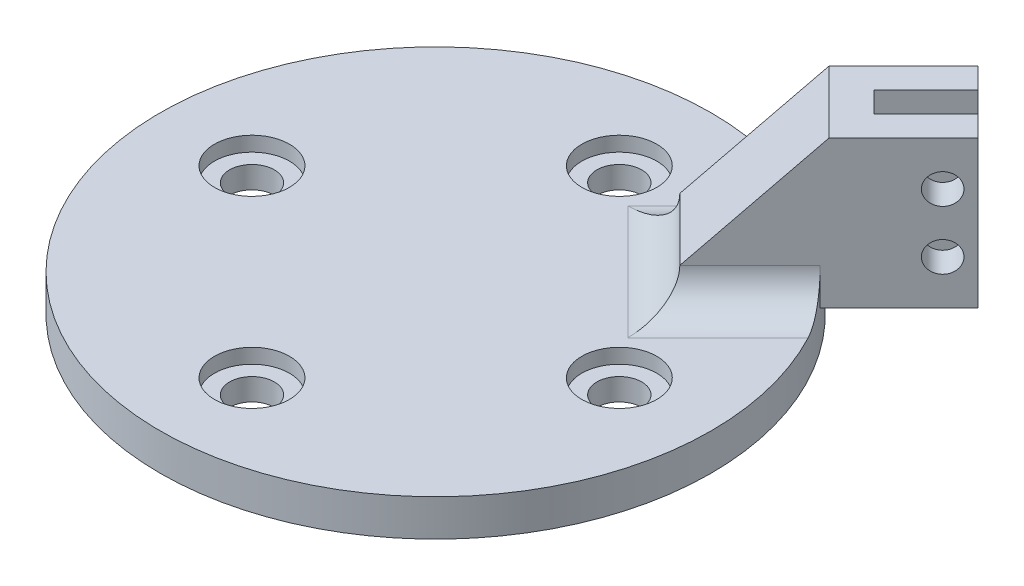
ISO-10303-21;
HEADER;
FILE_DESCRIPTION(('STEP AP214'),'2;1');
FILE_NAME('part.step','',(''),(''),'','','');
FILE_SCHEMA(('AUTOMOTIVE_DESIGN { 1 0 10303 214 1 1 1 1 }'));
ENDSEC;
DATA;
#1=APPLICATION_CONTEXT('core data for automotive mechanical design processes');
#2=APPLICATION_PROTOCOL_DEFINITION('international standard','automotive_design',2000,#1);
#3=PRODUCT_CONTEXT('',#1,'mechanical');
#4=PRODUCT('Part','Part','',(#3));
#5=PRODUCT_RELATED_PRODUCT_CATEGORY('part','',(#4));
#6=PRODUCT_DEFINITION_FORMATION('','',#4);
#7=PRODUCT_DEFINITION_CONTEXT('part definition',#1,'design');
#8=PRODUCT_DEFINITION('design','',#6,#7);
#9=PRODUCT_DEFINITION_SHAPE('','',#8);
#10=(LENGTH_UNIT() NAMED_UNIT(*) SI_UNIT(.MILLI.,.METRE.));
#11=(NAMED_UNIT(*) PLANE_ANGLE_UNIT() SI_UNIT($,.RADIAN.));
#12=(NAMED_UNIT(*) SI_UNIT($,.STERADIAN.) SOLID_ANGLE_UNIT());
#13=UNCERTAINTY_MEASURE_WITH_UNIT(LENGTH_MEASURE(1.E-05),#10,'distance_accuracy_value','');
#14=(GEOMETRIC_REPRESENTATION_CONTEXT(3) GLOBAL_UNCERTAINTY_ASSIGNED_CONTEXT((#13)) GLOBAL_UNIT_ASSIGNED_CONTEXT((#10,
#11,#12)) REPRESENTATION_CONTEXT('',''));
#15=CARTESIAN_POINT('',(0.,0.,0.));
#16=DIRECTION('',(0.,0.,1.));
#17=DIRECTION('',(1.,0.,0.));
#18=AXIS2_PLACEMENT_3D('',#15,#16,#17);
#19=CARTESIAN_POINT('',(29.8399061660723,25.,-29.8399061660724));
#20=DIRECTION('',(0.707106781186546,0.,-0.707106781186549));
#21=DIRECTION('',(-0.707106781186549,0.,-0.707106781186546));
#22=AXIS2_PLACEMENT_3D('',#19,#20,#21);
#23=PLANE('',#22);
#24=DIRECTION('',(0.707106781186549,0.,0.707106781186546));
#25=VECTOR('',#24,1.);
#26=CARTESIAN_POINT('',(29.8399061660723,5.,-29.8399061660724));
#27=LINE('',#26,#25);
#28=CARTESIAN_POINT('',(28.4256926036992,5.,-31.2541197284455));
#29=VERTEX_POINT('',#28);
#30=CARTESIAN_POINT('',(31.2541197284453,5.,-28.4256926036993));
#31=VERTEX_POINT('',#30);
#32=EDGE_CURVE('E381',#29,#31,#27,.T.);
#33=ORIENTED_EDGE('',*,*,#32,.F.);
#34=DIRECTION('',(0.,-1.,0.));
#35=VECTOR('',#34,1.);
#36=CARTESIAN_POINT('',(28.4256926036992,25.,-31.2541197284455));
#37=LINE('',#36,#35);
#38=CARTESIAN_POINT('',(28.4256926036992,25.,-31.2541197284455));
#39=VERTEX_POINT('',#38);
#40=EDGE_CURVE('E348',#39,#29,#37,.T.);
#41=ORIENTED_EDGE('',*,*,#40,.F.);
#42=DIRECTION('',(0.707106781186549,0.,0.707106781186546));
#43=VECTOR('',#42,1.);
#44=CARTESIAN_POINT('',(29.8399061660723,25.,-29.8399061660724));
#45=LINE('',#44,#43);
#46=CARTESIAN_POINT('',(31.2541197284453,25.,-28.4256926036993));
#47=VERTEX_POINT('',#46);
#48=EDGE_CURVE('E383',#39,#47,#45,.T.);
#49=ORIENTED_EDGE('',*,*,#48,.T.);
#50=DIRECTION('',(0.,1.,0.));
#51=VECTOR('',#50,1.);
#52=CARTESIAN_POINT('',(31.2541197284453,25.,-28.4256926036993));
#53=LINE('',#52,#51);
#54=EDGE_CURVE('E351',#31,#47,#53,.T.);
#55=ORIENTED_EDGE('',*,*,#54,.F.);
#56=EDGE_LOOP('',(#33,#41,#49,#55));
#57=FACE_BOUND('',#56,.T.);
#58=ADVANCED_FACE('F41',(#57),#23,.T.);
#59=CARTESIAN_POINT('',(0.,5.,0.));
#60=DIRECTION('',(0.,1.,0.));
#61=DIRECTION('',(0.,0.,1.));
#62=AXIS2_PLACEMENT_3D('',#59,#60,#61);
#63=PLANE('',#62);
#64=CARTESIAN_POINT('',(-25.,5.,0.));
#65=DIRECTION('',(0.,1.,0.));
#66=DIRECTION('',(1.,0.,0.));
#67=AXIS2_PLACEMENT_3D('',#64,#65,#66);
#68=CIRCLE('',#67,5.1);
#69=CARTESIAN_POINT('',(-19.9,5.,0.));
#70=VERTEX_POINT('',#69);
#71=EDGE_CURVE('E277',#70,#70,#68,.T.);
#72=ORIENTED_EDGE('',*,*,#71,.F.);
#73=EDGE_LOOP('',(#72));
#74=FACE_BOUND('',#73,.T.);
#75=CARTESIAN_POINT('',(0.,5.,25.));
#76=DIRECTION('',(0.,1.,0.));
#77=DIRECTION('',(0.,0.,-1.));
#78=AXIS2_PLACEMENT_3D('',#75,#76,#77);
#79=CIRCLE('',#78,5.1);
#80=CARTESIAN_POINT('',(0.,5.,19.9));
#81=VERTEX_POINT('',#80);
#82=EDGE_CURVE('E399',#81,#81,#79,.T.);
#83=ORIENTED_EDGE('',*,*,#82,.F.);
#84=EDGE_LOOP('',(#83));
#85=FACE_BOUND('',#84,.T.);
#86=CARTESIAN_POINT('',(25.,5.,-2.60126376937258E-13));
#87=DIRECTION('',(0.,1.,0.));
#88=DIRECTION('',(-1.,0.,0.));
#89=AXIS2_PLACEMENT_3D('',#86,#87,#88);
#90=CIRCLE('',#89,5.1);
#91=CARTESIAN_POINT('',(19.9,5.,-2.06706712452958E-13));
#92=VERTEX_POINT('',#91);
#93=EDGE_CURVE('E281',#92,#92,#90,.T.);
#94=ORIENTED_EDGE('',*,*,#93,.F.);
#95=EDGE_LOOP('',(#94));
#96=FACE_BOUND('',#95,.T.);
#97=CARTESIAN_POINT('',(0.,5.,-25.));
#98=DIRECTION('',(0.,1.,0.));
#99=DIRECTION('',(0.,0.,1.));
#100=AXIS2_PLACEMENT_3D('',#97,#98,#99);
#101=CIRCLE('',#100,5.1);
#102=CARTESIAN_POINT('',(0.,5.,-19.9));
#103=VERTEX_POINT('',#102);
#104=EDGE_CURVE('E270',#103,#103,#101,.T.);
#105=ORIENTED_EDGE('',*,*,#104,.F.);
#106=EDGE_LOOP('',(#105));
#107=FACE_BOUND('',#106,.T.);
#108=DIRECTION('',(0.707106781186549,0.,0.707106781186546));
#109=VECTOR('',#108,1.);
#110=CARTESIAN_POINT('',(13.0814754519511,5.,-13.0814754519512));
#111=LINE('',#110,#109);
#112=CARTESIAN_POINT('',(20.8596500450031,5.,-5.30330085889915));
#113=VERTEX_POINT('',#112);
#114=CARTESIAN_POINT('',(5.30330085889908,5.,-20.8596500450032));
#115=VERTEX_POINT('',#114);
#116=EDGE_CURVE('E158',#113,#115,#111,.F.);
#117=ORIENTED_EDGE('',*,*,#116,.T.);
#118=DIRECTION('',(0.707106781186546,0.,-0.707106781186549));
#119=VECTOR('',#118,1.);
#120=CARTESIAN_POINT('',(18.3967179568706,5.,-33.9530671429748));
#121=LINE('',#120,#119);
#122=CARTESIAN_POINT('',(17.5718747165647,5.,-33.1282239026688));
#123=VERTEX_POINT('',#122);
#124=EDGE_CURVE('E313',#115,#123,#121,.T.);
#125=ORIENTED_EDGE('',*,*,#124,.T.);
#126=CARTESIAN_POINT('',(0.,5.,0.));
#127=DIRECTION('',(0.,1.,0.));
#128=DIRECTION('',(0.,0.,1.));
#129=AXIS2_PLACEMENT_3D('',#126,#127,#128);
#130=CIRCLE('',#129,37.5);
#131=CARTESIAN_POINT('',(33.1282239026687,5.,-17.5718747165648));
#132=VERTEX_POINT('',#131);
#133=EDGE_CURVE('E298',#123,#132,#130,.T.);
#134=ORIENTED_EDGE('',*,*,#133,.T.);
#135=DIRECTION('',(0.707106781186546,0.,-0.707106781186549));
#136=VECTOR('',#135,1.);
#137=CARTESIAN_POINT('',(7.77817459305203,5.,7.77817459305201));
#138=LINE('',#137,#136);
#139=EDGE_CURVE('E141',#132,#113,#138,.F.);
#140=ORIENTED_EDGE('',*,*,#139,.T.);
#141=EDGE_LOOP('',(#117,#125,#134,#140));
#142=FACE_BOUND('',#141,.T.);
#143=ADVANCED_FACE('F193',(#74,#85,#96,#107,#142),#63,.T.);
#144=CARTESIAN_POINT('',(25.,5.,0.));
#145=DIRECTION('',(0.,-1.,0.));
#146=DIRECTION('',(0.,0.,-1.));
#147=AXIS2_PLACEMENT_3D('',#144,#145,#146);
#148=CYLINDRICAL_SURFACE('',#147,3.05);
#149=CARTESIAN_POINT('',(25.,0.,0.));
#150=DIRECTION('',(0.,1.,0.));
#151=DIRECTION('',(0.,0.,1.));
#152=AXIS2_PLACEMENT_3D('',#149,#150,#151);
#153=CIRCLE('',#152,3.05);
#154=CARTESIAN_POINT('',(25.,0.,3.05000000000009));
#155=VERTEX_POINT('',#154);
#156=EDGE_CURVE('E291',#155,#155,#153,.T.);
#157=ORIENTED_EDGE('',*,*,#156,.F.);
#158=EDGE_LOOP('',(#157));
#159=FACE_BOUND('',#158,.T.);
#160=CARTESIAN_POINT('',(25.,3.,-2.60126376937258E-13));
#161=DIRECTION('',(0.,1.,0.));
#162=DIRECTION('',(-1.,0.,0.));
#163=AXIS2_PLACEMENT_3D('',#160,#161,#162);
#164=CIRCLE('',#163,3.05);
#165=CARTESIAN_POINT('',(21.95,3.,-2.28179322686843E-13));
#166=VERTEX_POINT('',#165);
#167=EDGE_CURVE('E385',#166,#166,#164,.T.);
#168=ORIENTED_EDGE('',*,*,#167,.T.);
#169=EDGE_LOOP('',(#168));
#170=FACE_BOUND('',#169,.T.);
#171=ADVANCED_FACE('F201',(#159,#170),#148,.F.);
#172=CARTESIAN_POINT('',(-1.76308790418133E-13,5.,25.));
#173=DIRECTION('',(0.,-1.,0.));
#174=DIRECTION('',(0.,0.,-1.));
#175=AXIS2_PLACEMENT_3D('',#172,#173,#174);
#176=CYLINDRICAL_SURFACE('',#175,3.05);
#177=CARTESIAN_POINT('',(-1.76308790418133E-13,0.,25.));
#178=DIRECTION('',(0.,1.,0.));
#179=DIRECTION('',(0.,0.,1.));
#180=AXIS2_PLACEMENT_3D('',#177,#178,#179);
#181=CIRCLE('',#180,3.05);
#182=CARTESIAN_POINT('',(-1.76308790418133E-13,0.,28.05));
#183=VERTEX_POINT('',#182);
#184=EDGE_CURVE('E288',#183,#183,#181,.T.);
#185=ORIENTED_EDGE('',*,*,#184,.F.);
#186=EDGE_LOOP('',(#185));
#187=FACE_BOUND('',#186,.T.);
#188=CARTESIAN_POINT('',(0.,3.,25.));
#189=DIRECTION('',(0.,1.,0.));
#190=DIRECTION('',(0.,0.,-1.));
#191=AXIS2_PLACEMENT_3D('',#188,#189,#190);
#192=CIRCLE('',#191,3.05);
#193=CARTESIAN_POINT('',(0.,3.,21.95));
#194=VERTEX_POINT('',#193);
#195=EDGE_CURVE('E396',#194,#194,#192,.T.);
#196=ORIENTED_EDGE('',*,*,#195,.T.);
#197=EDGE_LOOP('',(#196));
#198=FACE_BOUND('',#197,.T.);
#199=ADVANCED_FACE('F249',(#187,#198),#176,.F.);
#200=CARTESIAN_POINT('',(-25.,5.,-2.67065270841165E-13));
#201=DIRECTION('',(0.,-1.,0.));
#202=DIRECTION('',(0.,0.,-1.));
#203=AXIS2_PLACEMENT_3D('',#200,#201,#202);
#204=CYLINDRICAL_SURFACE('',#203,3.05);
#205=CARTESIAN_POINT('',(-25.,0.,-2.67065270841165E-13));
#206=DIRECTION('',(0.,1.,0.));
#207=DIRECTION('',(0.,0.,1.));
#208=AXIS2_PLACEMENT_3D('',#205,#206,#207);
#209=CIRCLE('',#208,3.05);
#210=CARTESIAN_POINT('',(-25.,0.,3.04999999999973));
#211=VERTEX_POINT('',#210);
#212=EDGE_CURVE('E284',#211,#211,#209,.T.);
#213=ORIENTED_EDGE('',*,*,#212,.F.);
#214=EDGE_LOOP('',(#213));
#215=FACE_BOUND('',#214,.T.);
#216=CARTESIAN_POINT('',(-25.,3.,0.));
#217=DIRECTION('',(0.,1.,0.));
#218=DIRECTION('',(1.,0.,0.));
#219=AXIS2_PLACEMENT_3D('',#216,#217,#218);
#220=CIRCLE('',#219,3.05);
#221=CARTESIAN_POINT('',(-21.95,3.,0.));
#222=VERTEX_POINT('',#221);
#223=EDGE_CURVE('E390',#222,#222,#220,.T.);
#224=ORIENTED_EDGE('',*,*,#223,.T.);
#225=EDGE_LOOP('',(#224));
#226=FACE_BOUND('',#225,.T.);
#227=ADVANCED_FACE('F245',(#215,#226),#204,.F.);
#228=CARTESIAN_POINT('',(0.,5.,-25.));
#229=DIRECTION('',(0.,-1.,0.));
#230=DIRECTION('',(0.,0.,-1.));
#231=AXIS2_PLACEMENT_3D('',#228,#229,#230);
#232=CYLINDRICAL_SURFACE('',#231,3.05);
#233=CARTESIAN_POINT('',(0.,0.,-25.));
#234=DIRECTION('',(0.,1.,0.));
#235=DIRECTION('',(0.,0.,1.));
#236=AXIS2_PLACEMENT_3D('',#233,#234,#235);
#237=CIRCLE('',#236,3.05);
#238=CARTESIAN_POINT('',(0.,0.,-21.95));
#239=VERTEX_POINT('',#238);
#240=EDGE_CURVE('E266',#239,#239,#237,.T.);
#241=ORIENTED_EDGE('',*,*,#240,.F.);
#242=EDGE_LOOP('',(#241));
#243=FACE_BOUND('',#242,.T.);
#244=CARTESIAN_POINT('',(0.,3.,-25.));
#245=DIRECTION('',(0.,1.,0.));
#246=DIRECTION('',(0.,0.,1.));
#247=AXIS2_PLACEMENT_3D('',#244,#245,#246);
#248=CIRCLE('',#247,3.05);
#249=CARTESIAN_POINT('',(0.,3.,-21.95));
#250=VERTEX_POINT('',#249);
#251=EDGE_CURVE('E269',#250,#250,#248,.T.);
#252=ORIENTED_EDGE('',*,*,#251,.T.);
#253=EDGE_LOOP('',(#252));
#254=FACE_BOUND('',#253,.T.);
#255=ADVANCED_FACE('F248',(#243,#254),#232,.F.);
#256=CARTESIAN_POINT('',(0.,0.,0.));
#257=DIRECTION('',(0.,1.,0.));
#258=DIRECTION('',(0.,0.,1.));
#259=AXIS2_PLACEMENT_3D('',#256,#257,#258);
#260=PLANE('',#259);
#261=CARTESIAN_POINT('',(0.,0.,0.));
#262=DIRECTION('',(0.,1.,0.));
#263=DIRECTION('',(0.,0.,1.));
#264=AXIS2_PLACEMENT_3D('',#261,#262,#263);
#265=CIRCLE('',#264,37.5);
#266=CARTESIAN_POINT('',(0.,0.,37.5));
#267=VERTEX_POINT('',#266);
#268=EDGE_CURVE('E295',#267,#267,#265,.T.);
#269=ORIENTED_EDGE('',*,*,#268,.F.);
#270=EDGE_LOOP('',(#269));
#271=FACE_BOUND('',#270,.T.);
#272=ORIENTED_EDGE('',*,*,#240,.T.);
#273=EDGE_LOOP('',(#272));
#274=FACE_BOUND('',#273,.T.);
#275=ORIENTED_EDGE('',*,*,#156,.T.);
#276=EDGE_LOOP('',(#275));
#277=FACE_BOUND('',#276,.T.);
#278=ORIENTED_EDGE('',*,*,#184,.T.);
#279=EDGE_LOOP('',(#278));
#280=FACE_BOUND('',#279,.T.);
#281=ORIENTED_EDGE('',*,*,#212,.T.);
#282=EDGE_LOOP('',(#281));
#283=FACE_BOUND('',#282,.T.);
#284=ADVANCED_FACE('F181',(#271,#274,#277,#280,#283),#260,.F.);
#285=CARTESIAN_POINT('',(0.,5.,0.));
#286=DIRECTION('',(0.,-1.,0.));
#287=DIRECTION('',(0.,0.,-1.));
#288=AXIS2_PLACEMENT_3D('',#285,#286,#287);
#289=CYLINDRICAL_SURFACE('',#288,37.5);
#290=CARTESIAN_POINT('',(30.417533237042,5.,-21.9322518628035));
#291=VERTEX_POINT('',#290);
#292=CARTESIAN_POINT('',(21.9322518628034,5.,-30.4175332370421));
#293=VERTEX_POINT('',#292);
#294=EDGE_CURVE('E142',#291,#293,#130,.T.);
#295=ORIENTED_EDGE('',*,*,#294,.F.);
#296=DIRECTION('',(0.,-1.,0.));
#297=VECTOR('',#296,1.);
#298=CARTESIAN_POINT('',(30.417533237042,10.,-21.9322518628035));
#299=LINE('',#298,#297);
#300=CARTESIAN_POINT('',(30.417533237042,10.,-21.9322518628035));
#301=VERTEX_POINT('',#300);
#302=EDGE_CURVE('E64',#301,#291,#299,.T.);
#303=ORIENTED_EDGE('',*,*,#302,.F.);
#304=CARTESIAN_POINT('',(30.417533237042,10.,-21.9322518628035));
#305=CARTESIAN_POINT('',(30.4175196043828,9.86103745014727,-21.9322608019034));
#306=CARTESIAN_POINT('',(30.4209651241595,9.72207716601175,-21.9274919142501));
#307=CARTESIAN_POINT('',(30.4346760162601,9.44515358404793,-21.9084629791976));
#308=CARTESIAN_POINT('',(30.4449410220817,9.30719023304386,-21.8942034418578));
#309=CARTESIAN_POINT('',(30.4721800601415,9.03336241352067,-21.8562749453947));
#310=CARTESIAN_POINT('',(30.4891479816068,8.89749615007392,-21.8326145565279));
#311=CARTESIAN_POINT('',(30.5296006731575,8.62870083825056,-21.7760120282792));
#312=CARTESIAN_POINT('',(30.5530853673399,8.49577175568304,-21.7430699970037));
#313=CARTESIAN_POINT('',(30.6063210812862,8.23375565505023,-21.6680691593191));
#314=CARTESIAN_POINT('',(30.6360738399185,8.10466971450352,-21.6260078229642));
#315=CARTESIAN_POINT('',(30.7015265829302,7.85124435224794,-21.532986307673));
#316=CARTESIAN_POINT('',(30.7372287570554,7.72690669898496,-21.4820228518827));
#317=CARTESIAN_POINT('',(30.8141626802342,7.48396590543574,-21.3715209005029));
#318=CARTESIAN_POINT('',(30.8553915485965,7.36535982119525,-21.3119868709857));
#319=CARTESIAN_POINT('',(30.9429634236449,7.13459592113606,-21.1846403213639));
#320=CARTESIAN_POINT('',(30.9893083122477,7.02244050140945,-21.1168247539329));
#321=CARTESIAN_POINT('',(31.086686171401,6.80521318047844,-20.9732086135668));
#322=CARTESIAN_POINT('',(31.1377268707855,6.70015346923917,-20.8973948451909));
#323=CARTESIAN_POINT('',(31.2439112969583,6.4979954476015,-20.7383016124076));
#324=CARTESIAN_POINT('',(31.2990565297684,6.40090008719738,-20.6550194053872));
#325=CARTESIAN_POINT('',(31.4128465454003,6.21537779524835,-20.4815484229267));
#326=CARTESIAN_POINT('',(31.4714902839826,6.12694829772285,-20.3913617061013));
#327=CARTESIAN_POINT('',(31.5917236428525,5.95925090611773,-20.2045869737776));
#328=CARTESIAN_POINT('',(31.6533143222761,5.87998634143493,-20.107996651929));
#329=CARTESIAN_POINT('',(31.7794655119219,5.73036465002407,-19.9080306856058));
#330=CARTESIAN_POINT('',(31.8440499765591,5.66010705680573,-19.8045956831592));
#331=CARTESIAN_POINT('',(31.9750015672882,5.52983087688639,-19.5924684212609));
#332=CARTESIAN_POINT('',(32.0413694058715,5.46981645509373,-19.4837740462765));
#333=CARTESIAN_POINT('',(32.1752416115514,5.36038025417199,-19.2618949976531));
#334=CARTESIAN_POINT('',(32.2427456320397,5.31095530555289,-19.1487116796341));
#335=CARTESIAN_POINT('',(32.3783294405755,5.22288025308085,-18.9185532139142));
#336=CARTESIAN_POINT('',(32.4464093674679,5.18423282853626,-18.8015771313801));
#337=CARTESIAN_POINT('',(32.6179995462888,5.10061064205727,-18.5029485411288));
#338=CARTESIAN_POINT('',(32.7215522376869,5.06276960024102,-18.3192503602035));
#339=CARTESIAN_POINT('',(32.8754188304758,5.02504730019623,-18.0407352366708));
#340=CARTESIAN_POINT('',(32.9264285150488,5.01564634583158,-17.9474689994939));
#341=CARTESIAN_POINT('',(33.0278300979569,5.00312375505855,-17.7601740312214));
#342=CARTESIAN_POINT('',(33.0782219578964,5.0000025069648,-17.666145253334));
#343=CARTESIAN_POINT('',(33.1282239026687,5.,-17.5718747165648));
#344=B_SPLINE_CURVE_WITH_KNOTS('',3,(#304,#305,#306,#307,#308,#309,#310,#311,#312,#313,#314,
#315,#316,#317,#318,#319,#320,#321,#322,#323,#324,#325,#326,#327,#328,#329,#330,#331,#332,#333,
#334,#335,#336,#337,#338,#339,#340,#341,#342,#343),.UNSPECIFIED.,.F.,.F.,(4,2,2,2,2,2,2,2,2,2,2,
2,2,2,2,2,2,2,2,4),(0.,0.416759947104996,0.833497497936661,1.2498559998172,1.66620965242839,
2.08267896112574,2.4993018957289,2.91570851133149,3.33226881483844,3.74952743793801,
4.16693992214747,4.58422843378712,5.00166806304066,5.42338266466934,5.84526833049816,
6.26702754658223,6.68889151934691,7.32979650169298,7.64979821918371,7.96981972383054),.UNSPECIFIED.);
#345=EDGE_CURVE('E11',#301,#132,#344,.T.);
#346=ORIENTED_EDGE('',*,*,#345,.T.);
#347=ORIENTED_EDGE('',*,*,#133,.F.);
#348=CARTESIAN_POINT('',(17.5718747165647,5.,-33.1282239026688));
#349=CARTESIAN_POINT('',(17.7020077237922,4.99998679653392,-33.0592082687077));
#350=CARTESIAN_POINT('',(17.8317353481821,5.00594878766274,-32.9894064811907));
#351=CARTESIAN_POINT('',(18.0895301456277,5.02986429851464,-32.8487487577454));
#352=CARTESIAN_POINT('',(18.2175970295132,5.04781987873857,-32.7778926427288));
#353=CARTESIAN_POINT('',(18.4712675478019,5.09578117343243,-32.6356167884565));
#354=CARTESIAN_POINT('',(18.5968693229737,5.12579564231724,-32.564196676763));
#355=CARTESIAN_POINT('',(18.8446339396921,5.19780545830812,-32.4214466103037));
#356=CARTESIAN_POINT('',(18.9667970284282,5.23979994180354,-32.3501166494112));
#357=CARTESIAN_POINT('',(19.2070119608359,5.33568295822717,-32.2080765355426));
#358=CARTESIAN_POINT('',(19.3250575300253,5.38958879767341,-32.1373674416946));
#359=CARTESIAN_POINT('',(19.5560539144935,5.5090162550367,-31.9973281048101));
#360=CARTESIAN_POINT('',(19.6690028145358,5.5745421947213,-31.9279983854999));
#361=CARTESIAN_POINT('',(19.8888309249273,5.7167411416612,-31.7915260152239));
#362=CARTESIAN_POINT('',(19.995716731083,5.79340169956472,-31.7243810228665));
#363=CARTESIAN_POINT('',(20.2028309967027,5.95746633829053,-31.5928896114718));
#364=CARTESIAN_POINT('',(20.3030572044801,6.04487402465296,-31.5285441414981));
#365=CARTESIAN_POINT('',(20.4932585726351,6.22708600164879,-31.4052355814333));
#366=CARTESIAN_POINT('',(20.5834487764727,6.32159643237413,-31.3461697592108));
#367=CARTESIAN_POINT('',(20.7562639593169,6.51951094183591,-31.2320065559058));
#368=CARTESIAN_POINT('',(20.8388891282014,6.62291479722639,-31.1769090752279));
#369=CARTESIAN_POINT('',(20.9960794240947,6.83793799528716,-31.0712668517338));
#370=CARTESIAN_POINT('',(21.0706409195825,6.9495610017756,-31.0207241618876));
#371=CARTESIAN_POINT('',(21.2111659623715,7.18013288265424,-30.9248068052337));
#372=CARTESIAN_POINT('',(21.2771326983951,7.29907901585112,-30.879430222553));
#373=CARTESIAN_POINT('',(21.3987633864732,7.54081256452807,-30.7952639058999));
#374=CARTESIAN_POINT('',(21.4546193478612,7.66346121542177,-30.756352913793));
#375=CARTESIAN_POINT('',(21.5574035355469,7.91404517844553,-30.6843981190431));
#376=CARTESIAN_POINT('',(21.604335216789,8.04197842125537,-30.651352046188));
#377=CARTESIAN_POINT('',(21.6890147254244,8.30220205688566,-30.5914912154955));
#378=CARTESIAN_POINT('',(21.7267666228866,8.43449048908503,-30.5646736963228));
#379=CARTESIAN_POINT('',(21.7928978945443,8.702478433417,-30.5175561279196));
#380=CARTESIAN_POINT('',(21.821279800639,8.83817701339856,-30.4972543180972));
#381=CARTESIAN_POINT('',(21.8739593844949,9.14355407967111,-30.4595020763565));
#382=CARTESIAN_POINT('',(21.8958194194551,9.31387468462678,-30.4437791991749));
#383=CARTESIAN_POINT('',(21.9249670734447,9.65613735267531,-30.4227852839091));
#384=CARTESIAN_POINT('',(21.9322764567589,9.82807660699529,-30.4174986358284));
#385=CARTESIAN_POINT('',(21.9322518628034,10.,-30.4175332370421));
#386=B_SPLINE_CURVE_WITH_KNOTS('',3,(#348,#349,#350,#351,#352,#353,#354,#355,#356,#357,#358,
#359,#360,#361,#362,#363,#364,#365,#366,#367,#368,#369,#370,#371,#372,#373,#374,#375,#376,#377,
#378,#379,#380,#381,#382,#383,#384,#385),.UNSPECIFIED.,.F.,.F.,(4,2,2,2,2,2,2,2,2,2,2,2,2,2,2,2,
2,2,4),(0.,0.441796835404348,0.883669591115582,1.32586371537366,1.76802597096432,
2.21083493742236,2.65380894087519,3.09629142471771,3.53892276357157,3.96851081249104,
4.39808807605418,4.8278580035394,5.25746802623773,5.67778425135321,6.09793742254128,
6.51790396807459,6.93775693986689,7.45409933815616,7.969668830006),.UNSPECIFIED.);
#387=CARTESIAN_POINT('',(21.9322518628034,10.,-30.4175332370421));
#388=VERTEX_POINT('',#387);
#389=EDGE_CURVE('E51',#123,#388,#386,.T.);
#390=ORIENTED_EDGE('',*,*,#389,.T.);
#391=DIRECTION('',(0.,-1.,0.));
#392=VECTOR('',#391,1.);
#393=CARTESIAN_POINT('',(21.9322518628034,5.,-30.4175332370421));
#394=LINE('',#393,#392);
#395=EDGE_CURVE('E59',#293,#388,#394,.F.);
#396=ORIENTED_EDGE('',*,*,#395,.F.);
#397=EDGE_LOOP('',(#295,#303,#346,#347,#390,#396));
#398=FACE_BOUND('',#397,.T.);
#399=ORIENTED_EDGE('',*,*,#268,.T.);
#400=EDGE_LOOP('',(#399));
#401=FACE_BOUND('',#400,.T.);
#402=ADVANCED_FACE('F175',(#398,#401),#289,.T.);
#403=CARTESIAN_POINT('',(0.,3.,-25.));
#404=DIRECTION('',(0.,1.,0.));
#405=DIRECTION('',(0.,0.,1.));
#406=AXIS2_PLACEMENT_3D('',#403,#404,#405);
#407=CYLINDRICAL_SURFACE('',#406,5.1);
#408=CARTESIAN_POINT('',(0.,3.,-25.));
#409=DIRECTION('',(0.,1.,0.));
#410=DIRECTION('',(0.,0.,1.));
#411=AXIS2_PLACEMENT_3D('',#408,#409,#410);
#412=CIRCLE('',#411,5.1);
#413=CARTESIAN_POINT('',(0.,3.,-19.9));
#414=VERTEX_POINT('',#413);
#415=EDGE_CURVE('E274',#414,#414,#412,.T.);
#416=ORIENTED_EDGE('',*,*,#415,.F.);
#417=EDGE_LOOP('',(#416));
#418=FACE_BOUND('',#417,.T.);
#419=ORIENTED_EDGE('',*,*,#104,.T.);
#420=EDGE_LOOP('',(#419));
#421=FACE_BOUND('',#420,.T.);
#422=ADVANCED_FACE('F180',(#418,#421),#407,.F.);
#423=CARTESIAN_POINT('',(0.,3.,-25.));
#424=DIRECTION('',(0.,1.,0.));
#425=DIRECTION('',(0.,0.,1.));
#426=AXIS2_PLACEMENT_3D('',#423,#424,#425);
#427=PLANE('',#426);
#428=ORIENTED_EDGE('',*,*,#251,.F.);
#429=EDGE_LOOP('',(#428));
#430=FACE_BOUND('',#429,.T.);
#431=ORIENTED_EDGE('',*,*,#415,.T.);
#432=EDGE_LOOP('',(#431));
#433=FACE_BOUND('',#432,.T.);
#434=ADVANCED_FACE('F223',(#430,#433),#427,.T.);
#435=CARTESIAN_POINT('',(-25.,3.,0.));
#436=DIRECTION('',(0.,1.,0.));
#437=DIRECTION('',(0.,0.,1.));
#438=AXIS2_PLACEMENT_3D('',#435,#436,#437);
#439=CYLINDRICAL_SURFACE('',#438,5.1);
#440=CARTESIAN_POINT('',(-25.,3.,0.));
#441=DIRECTION('',(0.,1.,0.));
#442=DIRECTION('',(1.,0.,0.));
#443=AXIS2_PLACEMENT_3D('',#440,#441,#442);
#444=CIRCLE('',#443,5.1);
#445=CARTESIAN_POINT('',(-19.9,3.,0.));
#446=VERTEX_POINT('',#445);
#447=EDGE_CURVE('E271',#446,#446,#444,.T.);
#448=ORIENTED_EDGE('',*,*,#447,.F.);
#449=EDGE_LOOP('',(#448));
#450=FACE_BOUND('',#449,.T.);
#451=ORIENTED_EDGE('',*,*,#71,.T.);
#452=EDGE_LOOP('',(#451));
#453=FACE_BOUND('',#452,.T.);
#454=ADVANCED_FACE('F219',(#450,#453),#439,.F.);
#455=CARTESIAN_POINT('',(-25.,3.,0.));
#456=DIRECTION('',(0.,1.,0.));
#457=DIRECTION('',(1.,0.,0.));
#458=AXIS2_PLACEMENT_3D('',#455,#456,#457);
#459=PLANE('',#458);
#460=ORIENTED_EDGE('',*,*,#223,.F.);
#461=EDGE_LOOP('',(#460));
#462=FACE_BOUND('',#461,.T.);
#463=ORIENTED_EDGE('',*,*,#447,.T.);
#464=EDGE_LOOP('',(#463));
#465=FACE_BOUND('',#464,.T.);
#466=ADVANCED_FACE('F215',(#462,#465),#459,.T.);
#467=CARTESIAN_POINT('',(0.,3.,25.));
#468=DIRECTION('',(0.,1.,0.));
#469=DIRECTION('',(0.,0.,1.));
#470=AXIS2_PLACEMENT_3D('',#467,#468,#469);
#471=CYLINDRICAL_SURFACE('',#470,5.1);
#472=CARTESIAN_POINT('',(0.,3.,25.));
#473=DIRECTION('',(0.,1.,0.));
#474=DIRECTION('',(0.,0.,-1.));
#475=AXIS2_PLACEMENT_3D('',#472,#473,#474);
#476=CIRCLE('',#475,5.1);
#477=CARTESIAN_POINT('',(0.,3.,19.9));
#478=VERTEX_POINT('',#477);
#479=EDGE_CURVE('E392',#478,#478,#476,.T.);
#480=ORIENTED_EDGE('',*,*,#479,.F.);
#481=EDGE_LOOP('',(#480));
#482=FACE_BOUND('',#481,.T.);
#483=ORIENTED_EDGE('',*,*,#82,.T.);
#484=EDGE_LOOP('',(#483));
#485=FACE_BOUND('',#484,.T.);
#486=ADVANCED_FACE('F218',(#482,#485),#471,.F.);
#487=CARTESIAN_POINT('',(0.,3.,25.));
#488=DIRECTION('',(0.,1.,0.));
#489=DIRECTION('',(0.,0.,-1.));
#490=AXIS2_PLACEMENT_3D('',#487,#488,#489);
#491=PLANE('',#490);
#492=ORIENTED_EDGE('',*,*,#195,.F.);
#493=EDGE_LOOP('',(#492));
#494=FACE_BOUND('',#493,.T.);
#495=ORIENTED_EDGE('',*,*,#479,.T.);
#496=EDGE_LOOP('',(#495));
#497=FACE_BOUND('',#496,.T.);
#498=ADVANCED_FACE('F225',(#494,#497),#491,.T.);
#499=CARTESIAN_POINT('',(25.,3.,-2.60126376937258E-13));
#500=DIRECTION('',(0.,1.,0.));
#501=DIRECTION('',(0.,0.,1.));
#502=AXIS2_PLACEMENT_3D('',#499,#500,#501);
#503=CYLINDRICAL_SURFACE('',#502,5.1);
#504=CARTESIAN_POINT('',(25.,3.,-2.60126376937258E-13));
#505=DIRECTION('',(0.,1.,0.));
#506=DIRECTION('',(-1.,0.,0.));
#507=AXIS2_PLACEMENT_3D('',#504,#505,#506);
#508=CIRCLE('',#507,5.1);
#509=CARTESIAN_POINT('',(19.9,3.,-2.06706712452958E-13));
#510=VERTEX_POINT('',#509);
#511=EDGE_CURVE('E400',#510,#510,#508,.T.);
#512=ORIENTED_EDGE('',*,*,#511,.F.);
#513=EDGE_LOOP('',(#512));
#514=FACE_BOUND('',#513,.T.);
#515=ORIENTED_EDGE('',*,*,#93,.T.);
#516=EDGE_LOOP('',(#515));
#517=FACE_BOUND('',#516,.T.);
#518=ADVANCED_FACE('F228',(#514,#517),#503,.F.);
#519=CARTESIAN_POINT('',(25.,3.,-2.60126376937258E-13));
#520=DIRECTION('',(0.,1.,0.));
#521=DIRECTION('',(-1.,0.,0.));
#522=AXIS2_PLACEMENT_3D('',#519,#520,#521);
#523=PLANE('',#522);
#524=ORIENTED_EDGE('',*,*,#167,.F.);
#525=EDGE_LOOP('',(#524));
#526=FACE_BOUND('',#525,.T.);
#527=ORIENTED_EDGE('',*,*,#511,.T.);
#528=EDGE_LOOP('',(#527));
#529=FACE_BOUND('',#528,.T.);
#530=ADVANCED_FACE('F233',(#526,#529),#523,.T.);
#531=CARTESIAN_POINT('',(0.,5.,0.));
#532=DIRECTION('',(0.,1.,0.));
#533=DIRECTION('',(0.,0.,1.));
#534=AXIS2_PLACEMENT_3D('',#531,#532,#533);
#535=PLANE('',#534);
#536=DIRECTION('',(0.707106781186546,0.,-0.707106781186549));
#537=VECTOR('',#536,1.);
#538=CARTESIAN_POINT('',(4.24264068711929,5.,4.24264068711927));
#539=LINE('',#538,#537);
#540=CARTESIAN_POINT('',(41.153614665057,5.,-32.6683332908186));
#541=VERTEX_POINT('',#540);
#542=EDGE_CURVE('E387',#291,#541,#539,.T.);
#543=ORIENTED_EDGE('',*,*,#542,.F.);
#544=ORIENTED_EDGE('',*,*,#294,.T.);
#545=DIRECTION('',(0.707106781186546,0.,-0.707106781186549));
#546=VECTOR('',#545,1.);
#547=CARTESIAN_POINT('',(-4.24264068711928,5.,-4.24264068711926));
#548=LINE('',#547,#546);
#549=CARTESIAN_POINT('',(32.6683332908184,5.,-41.1536146650571));
#550=VERTEX_POINT('',#549);
#551=EDGE_CURVE('E320',#293,#550,#548,.T.);
#552=ORIENTED_EDGE('',*,*,#551,.T.);
#553=DIRECTION('',(-0.707106781186549,0.,-0.707106781186546));
#554=VECTOR('',#553,1.);
#555=CARTESIAN_POINT('',(32.6683332908184,5.,-41.1536146650571));
#556=LINE('',#555,#554);
#557=CARTESIAN_POINT('',(35.4967604155646,5.,-38.3251875403109));
#558=VERTEX_POINT('',#557);
#559=EDGE_CURVE('E347',#558,#550,#556,.T.);
#560=ORIENTED_EDGE('',*,*,#559,.F.);
#561=DIRECTION('',(-0.707106781186546,0.,0.707106781186549));
#562=VECTOR('',#561,1.);
#563=CARTESIAN_POINT('',(35.4967604155646,5.,-38.3251875403109));
#564=LINE('',#563,#562);
#565=EDGE_CURVE('E344',#558,#29,#564,.T.);
#566=ORIENTED_EDGE('',*,*,#565,.T.);
#567=ORIENTED_EDGE('',*,*,#32,.T.);
#568=DIRECTION('',(-0.707106781186546,0.,0.707106781186549));
#569=VECTOR('',#568,1.);
#570=CARTESIAN_POINT('',(38.3251875403108,5.,-35.4967604155648));
#571=LINE('',#570,#569);
#572=CARTESIAN_POINT('',(38.3251875403108,5.,-35.4967604155648));
#573=VERTEX_POINT('',#572);
#574=EDGE_CURVE('E376',#573,#31,#571,.T.);
#575=ORIENTED_EDGE('',*,*,#574,.F.);
#576=DIRECTION('',(-0.707106781186548,0.,-0.707106781186547));
#577=VECTOR('',#576,1.);
#578=CARTESIAN_POINT('',(41.153614665057,5.,-32.6683332908186));
#579=LINE('',#578,#577);
#580=EDGE_CURVE('E364',#541,#573,#579,.T.);
#581=ORIENTED_EDGE('',*,*,#580,.F.);
#582=EDGE_LOOP('',(#543,#544,#552,#560,#566,#567,#575,#581));
#583=FACE_BOUND('',#582,.T.);
#584=ADVANCED_FACE('F205',(#583),#535,.F.);
#585=CARTESIAN_POINT('',(-4.24264068711928,25.,-4.24264068711926));
#586=DIRECTION('',(-0.707106781186549,0.,-0.707106781186546));
#587=DIRECTION('',(-0.707106781186546,0.,0.707106781186549));
#588=AXIS2_PLACEMENT_3D('',#585,#586,#587);
#589=PLANE('',#588);
#590=DIRECTION('',(-0.488806888841549,-0.722589545206744,0.488806888841551));
#591=VECTOR('',#590,1.);
#592=CARTESIAN_POINT('',(9.73179352153755,6.09355510561644,-18.2170748957762));
#593=LINE('',#592,#591);
#594=CARTESIAN_POINT('',(22.5213509807915,25.,-31.0066323550302));
#595=VERTEX_POINT('',#594);
#596=CARTESIAN_POINT('',(12.3743686707646,10.,-20.8596500450032));
#597=VERTEX_POINT('',#596);
#598=EDGE_CURVE('E136',#595,#597,#593,.T.);
#599=ORIENTED_EDGE('',*,*,#598,.F.);
#600=DIRECTION('',(0.707106781186546,0.,-0.707106781186549));
#601=VECTOR('',#600,1.);
#602=CARTESIAN_POINT('',(-4.24264068711928,25.,-4.24264068711926));
#603=LINE('',#602,#601);
#604=CARTESIAN_POINT('',(32.6683332908184,25.,-41.1536146650571));
#605=VERTEX_POINT('',#604);
#606=EDGE_CURVE('E379',#595,#605,#603,.T.);
#607=ORIENTED_EDGE('',*,*,#606,.T.);
#608=DIRECTION('',(0.,1.,0.));
#609=VECTOR('',#608,1.);
#610=CARTESIAN_POINT('',(32.6683332908184,25.,-41.1536146650571));
#611=LINE('',#610,#609);
#612=EDGE_CURVE('E352',#550,#605,#611,.T.);
#613=ORIENTED_EDGE('',*,*,#612,.F.);
#614=ORIENTED_EDGE('',*,*,#551,.F.);
#615=ORIENTED_EDGE('',*,*,#395,.T.);
#616=DIRECTION('',(0.707106781186546,0.,-0.707106781186549));
#617=VECTOR('',#616,1.);
#618=CARTESIAN_POINT('',(12.3743686707646,10.,-20.8596500450032));
#619=LINE('',#618,#617);
#620=EDGE_CURVE('E315',#388,#597,#619,.F.);
#621=ORIENTED_EDGE('',*,*,#620,.T.);
#622=EDGE_LOOP('',(#599,#607,#613,#614,#615,#621));
#623=FACE_BOUND('',#622,.T.);
#624=CARTESIAN_POINT('',(30.2641702347841,19.,-38.7494516090229));
#625=DIRECTION('',(-0.707106781186549,0.,-0.707106781186546));
#626=DIRECTION('',(-0.707106781186546,0.,0.707106781186549));
#627=AXIS2_PLACEMENT_3D('',#624,#625,#626);
#628=CIRCLE('',#627,2.04999999999999);
#629=CARTESIAN_POINT('',(28.8146013333517,19.,-37.2998827075904));
#630=VERTEX_POINT('',#629);
#631=EDGE_CURVE('E338',#630,#630,#628,.T.);
#632=ORIENTED_EDGE('',*,*,#631,.F.);
#633=EDGE_LOOP('',(#632));
#634=FACE_BOUND('',#633,.T.);
#635=CARTESIAN_POINT('',(30.2641702347841,11.,-38.7494516090229));
#636=DIRECTION('',(-0.707106781186549,0.,-0.707106781186546));
#637=DIRECTION('',(-0.707106781186546,0.,0.707106781186549));
#638=AXIS2_PLACEMENT_3D('',#635,#636,#637);
#639=CIRCLE('',#638,2.04999999999999);
#640=CARTESIAN_POINT('',(28.8146013333517,11.,-37.2998827075904));
#641=VERTEX_POINT('',#640);
#642=EDGE_CURVE('E309',#641,#641,#639,.T.);
#643=ORIENTED_EDGE('',*,*,#642,.F.);
#644=EDGE_LOOP('',(#643));
#645=FACE_BOUND('',#644,.T.);
#646=ADVANCED_FACE('F210',(#623,#634,#645),#589,.T.);
#647=CARTESIAN_POINT('',(4.24264068711929,25.,4.24264068711927));
#648=DIRECTION('',(-0.707106781186549,0.,-0.707106781186546));
#649=DIRECTION('',(-0.707106781186546,0.,0.707106781186549));
#650=AXIS2_PLACEMENT_3D('',#647,#648,#649);
#651=PLANE('',#650);
#652=CARTESIAN_POINT('',(38.7494516090228,19.,-30.2641702347843));
#653=DIRECTION('',(0.707106781186549,0.,0.707106781186546));
#654=DIRECTION('',(0.707106781186546,0.,-0.707106781186549));
#655=AXIS2_PLACEMENT_3D('',#652,#653,#654);
#656=CIRCLE('',#655,2.04999999999999);
#657=CARTESIAN_POINT('',(40.1990205104552,19.,-31.7137391362167));
#658=VERTEX_POINT('',#657);
#659=EDGE_CURVE('E305',#658,#658,#656,.T.);
#660=ORIENTED_EDGE('',*,*,#659,.F.);
#661=EDGE_LOOP('',(#660));
#662=FACE_BOUND('',#661,.T.);
#663=CARTESIAN_POINT('',(38.7494516090228,11.,-30.2641702347843));
#664=DIRECTION('',(0.707106781186549,0.,0.707106781186546));
#665=DIRECTION('',(0.707106781186546,0.,-0.707106781186549));
#666=AXIS2_PLACEMENT_3D('',#663,#664,#665);
#667=CIRCLE('',#666,2.04999999999999);
#668=CARTESIAN_POINT('',(40.1990205104552,11.,-31.7137391362167));
#669=VERTEX_POINT('',#668);
#670=EDGE_CURVE('E323',#669,#669,#667,.T.);
#671=ORIENTED_EDGE('',*,*,#670,.F.);
#672=EDGE_LOOP('',(#671));
#673=FACE_BOUND('',#672,.T.);
#674=DIRECTION('',(0.707106781186546,0.,-0.707106781186549));
#675=VECTOR('',#674,1.);
#676=CARTESIAN_POINT('',(4.24264068711929,25.,4.24264068711927));
#677=LINE('',#676,#675);
#678=CARTESIAN_POINT('',(31.0066323550301,25.,-22.5213509807916));
#679=VERTEX_POINT('',#678);
#680=CARTESIAN_POINT('',(41.153614665057,25.,-32.6683332908186));
#681=VERTEX_POINT('',#680);
#682=EDGE_CURVE('E151',#679,#681,#677,.T.);
#683=ORIENTED_EDGE('',*,*,#682,.F.);
#684=DIRECTION('',(0.488806888841549,0.722589545206744,-0.488806888841551));
#685=VECTOR('',#684,1.);
#686=CARTESIAN_POINT('',(20.8596500450031,10.,-12.3743686707646));
#687=LINE('',#686,#685);
#688=CARTESIAN_POINT('',(20.8596500450031,10.,-12.3743686707646));
#689=VERTEX_POINT('',#688);
#690=EDGE_CURVE('E133',#689,#679,#687,.T.);
#691=ORIENTED_EDGE('',*,*,#690,.F.);
#692=DIRECTION('',(0.707106781186546,0.,-0.707106781186549));
#693=VECTOR('',#692,1.);
#694=CARTESIAN_POINT('',(4.24264068711929,10.,4.24264068711927));
#695=LINE('',#694,#693);
#696=EDGE_CURVE('E148',#689,#301,#695,.T.);
#697=ORIENTED_EDGE('',*,*,#696,.T.);
#698=ORIENTED_EDGE('',*,*,#302,.T.);
#699=ORIENTED_EDGE('',*,*,#542,.T.);
#700=DIRECTION('',(0.,-1.,0.));
#701=VECTOR('',#700,1.);
#702=CARTESIAN_POINT('',(41.153614665057,25.,-32.6683332908186));
#703=LINE('',#702,#701);
#704=EDGE_CURVE('E361',#681,#541,#703,.T.);
#705=ORIENTED_EDGE('',*,*,#704,.F.);
#706=EDGE_LOOP('',(#683,#691,#697,#698,#699,#705));
#707=FACE_BOUND('',#706,.T.);
#708=ADVANCED_FACE('F146',(#662,#673,#707),#651,.F.);
#709=CARTESIAN_POINT('',(0.,25.,0.));
#710=DIRECTION('',(0.,1.,0.));
#711=DIRECTION('',(0.,0.,1.));
#712=AXIS2_PLACEMENT_3D('',#709,#710,#711);
#713=PLANE('',#712);
#714=DIRECTION('',(0.707106781186549,0.,0.707106781186546));
#715=VECTOR('',#714,1.);
#716=CARTESIAN_POINT('',(18.9858170748587,25.,-34.5421662609629));
#717=LINE('',#716,#715);
#718=EDGE_CURVE('E152',#595,#679,#717,.T.);
#719=ORIENTED_EDGE('',*,*,#718,.T.);
#720=ORIENTED_EDGE('',*,*,#682,.T.);
#721=DIRECTION('',(0.707106781186549,0.,0.707106781186546));
#722=VECTOR('',#721,1.);
#723=CARTESIAN_POINT('',(41.153614665057,25.,-32.6683332908186));
#724=LINE('',#723,#722);
#725=CARTESIAN_POINT('',(38.3251875403108,25.,-35.4967604155648));
#726=VERTEX_POINT('',#725);
#727=EDGE_CURVE('E368',#726,#681,#724,.T.);
#728=ORIENTED_EDGE('',*,*,#727,.F.);
#729=DIRECTION('',(-0.707106781186546,0.,0.707106781186549));
#730=VECTOR('',#729,1.);
#731=CARTESIAN_POINT('',(38.3251875403108,25.,-35.4967604155648));
#732=LINE('',#731,#730);
#733=EDGE_CURVE('E371',#726,#47,#732,.T.);
#734=ORIENTED_EDGE('',*,*,#733,.T.);
#735=ORIENTED_EDGE('',*,*,#48,.F.);
#736=DIRECTION('',(-0.707106781186546,0.,0.707106781186549));
#737=VECTOR('',#736,1.);
#738=CARTESIAN_POINT('',(35.4967604155646,25.,-38.3251875403109));
#739=LINE('',#738,#737);
#740=CARTESIAN_POINT('',(35.4967604155646,25.,-38.3251875403109));
#741=VERTEX_POINT('',#740);
#742=EDGE_CURVE('E341',#741,#39,#739,.T.);
#743=ORIENTED_EDGE('',*,*,#742,.F.);
#744=DIRECTION('',(0.707106781186549,0.,0.707106781186546));
#745=VECTOR('',#744,1.);
#746=CARTESIAN_POINT('',(32.6683332908184,25.,-41.1536146650571));
#747=LINE('',#746,#745);
#748=EDGE_CURVE('E357',#605,#741,#747,.T.);
#749=ORIENTED_EDGE('',*,*,#748,.F.);
#750=ORIENTED_EDGE('',*,*,#606,.F.);
#751=EDGE_LOOP('',(#719,#720,#728,#734,#735,#743,#749,#750));
#752=FACE_BOUND('',#751,.T.);
#753=ADVANCED_FACE('F209',(#752),#713,.T.);
#754=CARTESIAN_POINT('',(38.3251875403108,25.,-35.4967604155648));
#755=DIRECTION('',(0.707106781186549,0.,0.707106781186546));
#756=DIRECTION('',(0.707106781186546,0.,-0.707106781186549));
#757=AXIS2_PLACEMENT_3D('',#754,#755,#756);
#758=PLANE('',#757);
#759=CARTESIAN_POINT('',(35.9210244842766,19.,-33.0925973595305));
#760=DIRECTION('',(0.707106781186549,0.,0.707106781186546));
#761=DIRECTION('',(0.707106781186546,0.,-0.707106781186549));
#762=AXIS2_PLACEMENT_3D('',#759,#760,#761);
#763=CIRCLE('',#762,2.04999999999999);
#764=CARTESIAN_POINT('',(37.370593385709,19.,-34.5421662609629));
#765=VERTEX_POINT('',#764);
#766=EDGE_CURVE('E308',#765,#765,#763,.T.);
#767=ORIENTED_EDGE('',*,*,#766,.T.);
#768=EDGE_LOOP('',(#767));
#769=FACE_BOUND('',#768,.T.);
#770=CARTESIAN_POINT('',(35.9210244842766,11.,-33.0925973595305));
#771=DIRECTION('',(0.707106781186549,0.,0.707106781186546));
#772=DIRECTION('',(0.707106781186546,0.,-0.707106781186549));
#773=AXIS2_PLACEMENT_3D('',#770,#771,#772);
#774=CIRCLE('',#773,2.04999999999999);
#775=CARTESIAN_POINT('',(37.370593385709,11.,-34.5421662609629));
#776=VERTEX_POINT('',#775);
#777=EDGE_CURVE('E304',#776,#776,#774,.T.);
#778=ORIENTED_EDGE('',*,*,#777,.T.);
#779=EDGE_LOOP('',(#778));
#780=FACE_BOUND('',#779,.T.);
#781=ORIENTED_EDGE('',*,*,#54,.T.);
#782=ORIENTED_EDGE('',*,*,#733,.F.);
#783=DIRECTION('',(0.,1.,0.));
#784=VECTOR('',#783,1.);
#785=CARTESIAN_POINT('',(38.3251875403108,25.,-35.4967604155648));
#786=LINE('',#785,#784);
#787=EDGE_CURVE('E366',#573,#726,#786,.T.);
#788=ORIENTED_EDGE('',*,*,#787,.F.);
#789=ORIENTED_EDGE('',*,*,#574,.T.);
#790=EDGE_LOOP('',(#781,#782,#788,#789));
#791=FACE_BOUND('',#790,.T.);
#792=ADVANCED_FACE('F466',(#769,#780,#791),#758,.F.);
#793=CARTESIAN_POINT('',(36.9109739779378,0.,-36.9109739779378));
#794=DIRECTION('',(0.707106781186547,0.,-0.707106781186548));
#795=DIRECTION('',(-0.707106781186548,0.,-0.707106781186547));
#796=AXIS2_PLACEMENT_3D('',#793,#794,#795);
#797=PLANE('',#796);
#798=ORIENTED_EDGE('',*,*,#704,.T.);
#799=ORIENTED_EDGE('',*,*,#580,.T.);
#800=ORIENTED_EDGE('',*,*,#787,.T.);
#801=ORIENTED_EDGE('',*,*,#727,.T.);
#802=EDGE_LOOP('',(#798,#799,#800,#801));
#803=FACE_BOUND('',#802,.T.);
#804=ADVANCED_FACE('F447',(#803),#797,.T.);
#805=CARTESIAN_POINT('',(35.4967604155646,25.,-38.3251875403109));
#806=DIRECTION('',(-0.707106781186549,0.,-0.707106781186546));
#807=DIRECTION('',(-0.707106781186546,0.,0.707106781186549));
#808=AXIS2_PLACEMENT_3D('',#805,#806,#807);
#809=PLANE('',#808);
#810=CARTESIAN_POINT('',(33.0925973595304,19.,-35.9210244842767));
#811=DIRECTION('',(-0.707106781186549,0.,-0.707106781186546));
#812=DIRECTION('',(-0.707106781186546,0.,0.707106781186549));
#813=AXIS2_PLACEMENT_3D('',#810,#811,#812);
#814=CIRCLE('',#813,2.04999999999999);
#815=CARTESIAN_POINT('',(31.6430284580979,19.,-34.4714555828442));
#816=VERTEX_POINT('',#815);
#817=EDGE_CURVE('E306',#816,#816,#814,.T.);
#818=ORIENTED_EDGE('',*,*,#817,.T.);
#819=EDGE_LOOP('',(#818));
#820=FACE_BOUND('',#819,.T.);
#821=CARTESIAN_POINT('',(33.0925973595304,11.,-35.9210244842767));
#822=DIRECTION('',(-0.707106781186549,0.,-0.707106781186546));
#823=DIRECTION('',(-0.707106781186546,0.,0.707106781186549));
#824=AXIS2_PLACEMENT_3D('',#821,#822,#823);
#825=CIRCLE('',#824,2.04999999999999);
#826=CARTESIAN_POINT('',(31.6430284580979,11.,-34.4714555828442));
#827=VERTEX_POINT('',#826);
#828=EDGE_CURVE('E301',#827,#827,#825,.T.);
#829=ORIENTED_EDGE('',*,*,#828,.T.);
#830=EDGE_LOOP('',(#829));
#831=FACE_BOUND('',#830,.T.);
#832=ORIENTED_EDGE('',*,*,#40,.T.);
#833=ORIENTED_EDGE('',*,*,#565,.F.);
#834=DIRECTION('',(0.,-1.,0.));
#835=VECTOR('',#834,1.);
#836=CARTESIAN_POINT('',(35.4967604155646,25.,-38.3251875403109));
#837=LINE('',#836,#835);
#838=EDGE_CURVE('E355',#741,#558,#837,.T.);
#839=ORIENTED_EDGE('',*,*,#838,.F.);
#840=ORIENTED_EDGE('',*,*,#742,.T.);
#841=EDGE_LOOP('',(#832,#833,#839,#840));
#842=FACE_BOUND('',#841,.T.);
#843=ADVANCED_FACE('F463',(#820,#831,#842),#809,.F.);
#844=CARTESIAN_POINT('',(36.9109739779377,0.,-36.9109739779379));
#845=DIRECTION('',(-0.707106781186546,0.,0.707106781186549));
#846=DIRECTION('',(0.707106781186549,0.,0.707106781186546));
#847=AXIS2_PLACEMENT_3D('',#844,#845,#846);
#848=PLANE('',#847);
#849=ORIENTED_EDGE('',*,*,#612,.T.);
#850=ORIENTED_EDGE('',*,*,#748,.T.);
#851=ORIENTED_EDGE('',*,*,#838,.T.);
#852=ORIENTED_EDGE('',*,*,#559,.T.);
#853=EDGE_LOOP('',(#849,#850,#851,#852));
#854=FACE_BOUND('',#853,.T.);
#855=ADVANCED_FACE('F458',(#854),#848,.F.);
#856=CARTESIAN_POINT('',(26.7286363288514,11.,-42.2849855149556));
#857=DIRECTION('',(0.707106781186549,0.,0.707106781186546));
#858=DIRECTION('',(0.707106781186546,0.,-0.707106781186549));
#859=AXIS2_PLACEMENT_3D('',#856,#857,#858);
#860=CYLINDRICAL_SURFACE('',#859,2.04999999999999);
#861=ORIENTED_EDGE('',*,*,#642,.T.);
#862=EDGE_LOOP('',(#861));
#863=FACE_BOUND('',#862,.T.);
#864=ORIENTED_EDGE('',*,*,#828,.F.);
#865=EDGE_LOOP('',(#864));
#866=FACE_BOUND('',#865,.T.);
#867=ADVANCED_FACE('F480',(#863,#866),#860,.F.);
#868=CARTESIAN_POINT('',(26.7286363288514,19.,-42.2849855149556));
#869=DIRECTION('',(0.707106781186549,0.,0.707106781186546));
#870=DIRECTION('',(0.707106781186546,0.,-0.707106781186549));
#871=AXIS2_PLACEMENT_3D('',#868,#869,#870);
#872=CYLINDRICAL_SURFACE('',#871,2.04999999999999);
#873=ORIENTED_EDGE('',*,*,#631,.T.);
#874=EDGE_LOOP('',(#873));
#875=FACE_BOUND('',#874,.T.);
#876=ORIENTED_EDGE('',*,*,#817,.F.);
#877=EDGE_LOOP('',(#876));
#878=FACE_BOUND('',#877,.T.);
#879=ADVANCED_FACE('F486',(#875,#878),#872,.F.);
#880=ORIENTED_EDGE('',*,*,#670,.T.);
#881=EDGE_LOOP('',(#880));
#882=FACE_BOUND('',#881,.T.);
#883=ORIENTED_EDGE('',*,*,#777,.F.);
#884=EDGE_LOOP('',(#883));
#885=FACE_BOUND('',#884,.T.);
#886=ADVANCED_FACE('F483',(#882,#885),#860,.F.);
#887=ORIENTED_EDGE('',*,*,#659,.T.);
#888=EDGE_LOOP('',(#887));
#889=FACE_BOUND('',#888,.T.);
#890=ORIENTED_EDGE('',*,*,#766,.F.);
#891=EDGE_LOOP('',(#890));
#892=FACE_BOUND('',#891,.T.);
#893=ADVANCED_FACE('F190',(#889,#892),#872,.F.);
#894=CARTESIAN_POINT('',(-7.77817459305203,10.,-7.77817459305199));
#895=DIRECTION('',(-0.707106781186546,0.,0.707106781186549));
#896=DIRECTION('',(0.707106781186549,0.,0.707106781186546));
#897=AXIS2_PLACEMENT_3D('',#894,#895,#896);
#898=CYLINDRICAL_SURFACE('',#897,5.);
#899=ORIENTED_EDGE('',*,*,#389,.F.);
#900=ORIENTED_EDGE('',*,*,#124,.F.);
#901=CARTESIAN_POINT('',(5.30330085889908,10.,-20.8596500450032));
#902=DIRECTION('',(0.,0.,1.));
#903=DIRECTION('',(-1.,0.,0.));
#904=AXIS2_PLACEMENT_3D('',#901,#902,#903);
#905=ELLIPSE('',#904,7.07106781186547,5.);
#906=EDGE_CURVE('E46',#597,#115,#905,.F.);
#907=ORIENTED_EDGE('',*,*,#906,.F.);
#908=ORIENTED_EDGE('',*,*,#620,.F.);
#909=EDGE_LOOP('',(#899,#900,#907,#908));
#910=FACE_BOUND('',#909,.T.);
#911=ADVANCED_FACE('F43',(#910),#898,.F.);
#912=CARTESIAN_POINT('',(7.77817459305203,10.,7.77817459305201));
#913=DIRECTION('',(0.707106781186546,0.,-0.707106781186549));
#914=DIRECTION('',(-0.707106781186549,0.,-0.707106781186546));
#915=AXIS2_PLACEMENT_3D('',#912,#913,#914);
#916=CYLINDRICAL_SURFACE('',#915,5.);
#917=ORIENTED_EDGE('',*,*,#345,.F.);
#918=ORIENTED_EDGE('',*,*,#696,.F.);
#919=CARTESIAN_POINT('',(20.8596500450031,10.,-5.30330085889915));
#920=DIRECTION('',(1.,0.,0.));
#921=DIRECTION('',(0.,0.,-1.));
#922=AXIS2_PLACEMENT_3D('',#919,#920,#921);
#923=ELLIPSE('',#922,7.07106781186547,5.);
#924=EDGE_CURVE('E156',#113,#689,#923,.T.);
#925=ORIENTED_EDGE('',*,*,#924,.F.);
#926=ORIENTED_EDGE('',*,*,#139,.F.);
#927=EDGE_LOOP('',(#917,#918,#925,#926));
#928=FACE_BOUND('',#927,.T.);
#929=ADVANCED_FACE('F161',(#928),#916,.F.);
#930=CARTESIAN_POINT('',(13.0814754519511,10.,-13.0814754519512));
#931=DIRECTION('',(0.707106781186549,0.,0.707106781186546));
#932=DIRECTION('',(0.707106781186546,0.,-0.707106781186549));
#933=AXIS2_PLACEMENT_3D('',#930,#931,#932);
#934=CYLINDRICAL_SURFACE('',#933,5.);
#935=ORIENTED_EDGE('',*,*,#906,.T.);
#936=ORIENTED_EDGE('',*,*,#116,.F.);
#937=ORIENTED_EDGE('',*,*,#924,.T.);
#938=DIRECTION('',(0.707106781186549,0.,0.707106781186546));
#939=VECTOR('',#938,1.);
#940=CARTESIAN_POINT('',(16.6170093578838,10.,-16.6170093578839));
#941=LINE('',#940,#939);
#942=EDGE_CURVE('E130',#597,#689,#941,.T.);
#943=ORIENTED_EDGE('',*,*,#942,.F.);
#944=EDGE_LOOP('',(#935,#936,#937,#943));
#945=FACE_BOUND('',#944,.T.);
#946=ADVANCED_FACE('F157',(#945),#934,.F.);
#947=CARTESIAN_POINT('',(8.83883476483181,10.,-24.3951839509359));
#948=DIRECTION('',(0.510947967430191,-0.691277331581118,-0.510947967430193));
#949=DIRECTION('',(0.,0.594393959588992,-0.804173999084849));
#950=AXIS2_PLACEMENT_3D('',#947,#948,#949);
#951=PLANE('',#950);
#952=ORIENTED_EDGE('',*,*,#598,.T.);
#953=ORIENTED_EDGE('',*,*,#942,.T.);
#954=ORIENTED_EDGE('',*,*,#690,.T.);
#955=ORIENTED_EDGE('',*,*,#718,.F.);
#956=EDGE_LOOP('',(#952,#953,#954,#955));
#957=FACE_BOUND('',#956,.T.);
#958=ADVANCED_FACE('F132',(#957),#951,.F.);
#959=CLOSED_SHELL('',(#58,#143,#171,#199,#227,#255,#284,#402,#422,#434,#454,#466,#486,#498,#518,
#530,#584,#646,#708,#753,#792,#804,#843,#855,#867,#879,#886,#893,#911,#929,#946,#958));
#960=MANIFOLD_SOLID_BREP('B2',#959);
#961=ADVANCED_BREP_SHAPE_REPRESENTATION('',(#18,#960),#14);
#962=SHAPE_DEFINITION_REPRESENTATION(#9,#961);
ENDSEC;
END-ISO-10303-21;
